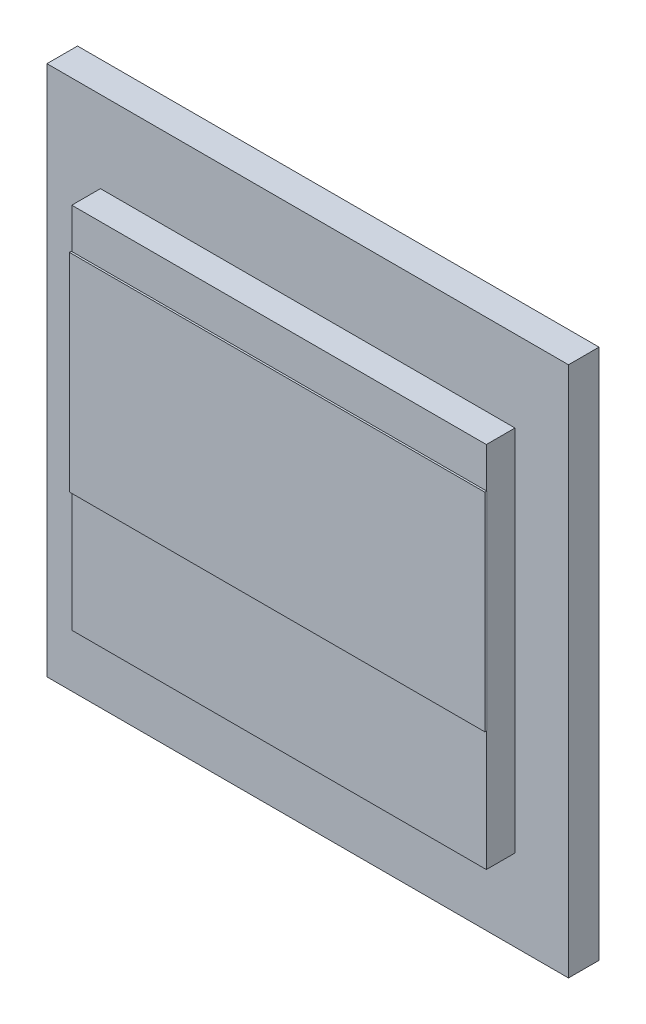
ISO-10303-21;
HEADER;
FILE_DESCRIPTION(('STEP AP214'),'2;1');
FILE_NAME('part.step','',(''),(''),'','','');
FILE_SCHEMA(('AUTOMOTIVE_DESIGN { 1 0 10303 214 1 1 1 1 }'));
ENDSEC;
DATA;
#1=APPLICATION_CONTEXT('core data for automotive mechanical design processes');
#2=APPLICATION_PROTOCOL_DEFINITION('international standard','automotive_design',2000,#1);
#3=PRODUCT_CONTEXT('',#1,'mechanical');
#4=PRODUCT('Part','Part','',(#3));
#5=PRODUCT_RELATED_PRODUCT_CATEGORY('part','',(#4));
#6=PRODUCT_DEFINITION_FORMATION('','',#4);
#7=PRODUCT_DEFINITION_CONTEXT('part definition',#1,'design');
#8=PRODUCT_DEFINITION('design','',#6,#7);
#9=PRODUCT_DEFINITION_SHAPE('','',#8);
#10=(LENGTH_UNIT() NAMED_UNIT(*) SI_UNIT(.MILLI.,.METRE.));
#11=(NAMED_UNIT(*) PLANE_ANGLE_UNIT() SI_UNIT($,.RADIAN.));
#12=(NAMED_UNIT(*) SI_UNIT($,.STERADIAN.) SOLID_ANGLE_UNIT());
#13=UNCERTAINTY_MEASURE_WITH_UNIT(LENGTH_MEASURE(1.E-05),#10,'distance_accuracy_value','');
#14=(GEOMETRIC_REPRESENTATION_CONTEXT(3) GLOBAL_UNCERTAINTY_ASSIGNED_CONTEXT((#13)) GLOBAL_UNIT_ASSIGNED_CONTEXT((#10,
#11,#12)) REPRESENTATION_CONTEXT('',''));
#15=CARTESIAN_POINT('',(0.,0.,0.));
#16=DIRECTION('',(0.,0.,1.));
#17=DIRECTION('',(1.,0.,0.));
#18=AXIS2_PLACEMENT_3D('',#15,#16,#17);
#19=CARTESIAN_POINT('',(0.,0.,3.1));
#20=DIRECTION('',(0.,0.,1.));
#21=DIRECTION('',(1.,0.,0.));
#22=AXIS2_PLACEMENT_3D('',#19,#20,#21);
#23=PLANE('',#22);
#24=DIRECTION('',(-1.,0.,0.));
#25=VECTOR('',#24,1.);
#26=CARTESIAN_POINT('',(-10.872,7.534,3.1));
#27=LINE('',#26,#25);
#28=CARTESIAN_POINT('',(10.85,7.534,3.1));
#29=VERTEX_POINT('',#28);
#30=CARTESIAN_POINT('',(-10.85,7.534,3.1));
#31=VERTEX_POINT('',#30);
#32=EDGE_CURVE('E11',#29,#31,#27,.T.);
#33=ORIENTED_EDGE('',*,*,#32,.F.);
#34=DIRECTION('',(0.,1.,0.));
#35=VECTOR('',#34,1.);
#36=CARTESIAN_POINT('',(10.85,9.634,3.1));
#37=LINE('',#36,#35);
#38=CARTESIAN_POINT('',(10.85,9.634,3.1));
#39=VERTEX_POINT('',#38);
#40=EDGE_CURVE('E177',#29,#39,#37,.T.);
#41=ORIENTED_EDGE('',*,*,#40,.T.);
#42=DIRECTION('',(-1.,0.,0.));
#43=VECTOR('',#42,1.);
#44=CARTESIAN_POINT('',(-10.85,9.634,3.1));
#45=LINE('',#44,#43);
#46=CARTESIAN_POINT('',(-10.85,9.634,3.1));
#47=VERTEX_POINT('',#46);
#48=EDGE_CURVE('E180',#39,#47,#45,.T.);
#49=ORIENTED_EDGE('',*,*,#48,.T.);
#50=DIRECTION('',(0.,-1.,0.));
#51=VECTOR('',#50,1.);
#52=CARTESIAN_POINT('',(-10.85,9.634,3.1));
#53=LINE('',#52,#51);
#54=EDGE_CURVE('E171',#47,#31,#53,.T.);
#55=ORIENTED_EDGE('',*,*,#54,.T.);
#56=EDGE_LOOP('',(#33,#41,#49,#55));
#57=FACE_BOUND('',#56,.T.);
#58=ADVANCED_FACE('F34',(#57),#23,.T.);
#59=CARTESIAN_POINT('',(0.,0.,1.6));
#60=DIRECTION('',(0.,0.,1.));
#61=DIRECTION('',(1.,0.,0.));
#62=AXIS2_PLACEMENT_3D('',#59,#60,#61);
#63=PLANE('',#62);
#64=DIRECTION('',(0.,-1.,0.));
#65=VECTOR('',#64,1.);
#66=CARTESIAN_POINT('',(-13.65,13.9,1.6));
#67=LINE('',#66,#65);
#68=CARTESIAN_POINT('',(-13.65,13.9,1.6));
#69=VERTEX_POINT('',#68);
#70=CARTESIAN_POINT('',(-13.65,-13.9,1.6));
#71=VERTEX_POINT('',#70);
#72=EDGE_CURVE('E200',#69,#71,#67,.T.);
#73=ORIENTED_EDGE('',*,*,#72,.T.);
#74=DIRECTION('',(1.,0.,0.));
#75=VECTOR('',#74,1.);
#76=CARTESIAN_POINT('',(-13.65,-13.9,1.6));
#77=LINE('',#76,#75);
#78=CARTESIAN_POINT('',(13.65,-13.9,1.6));
#79=VERTEX_POINT('',#78);
#80=EDGE_CURVE('E203',#71,#79,#77,.T.);
#81=ORIENTED_EDGE('',*,*,#80,.T.);
#82=DIRECTION('',(0.,1.,0.));
#83=VECTOR('',#82,1.);
#84=CARTESIAN_POINT('',(13.65,13.9,1.6));
#85=LINE('',#84,#83);
#86=CARTESIAN_POINT('',(13.65,13.9,1.6));
#87=VERTEX_POINT('',#86);
#88=EDGE_CURVE('E206',#79,#87,#85,.T.);
#89=ORIENTED_EDGE('',*,*,#88,.T.);
#90=DIRECTION('',(-1.,0.,0.));
#91=VECTOR('',#90,1.);
#92=CARTESIAN_POINT('',(-13.65,13.9,1.6));
#93=LINE('',#92,#91);
#94=EDGE_CURVE('E208',#87,#69,#93,.T.);
#95=ORIENTED_EDGE('',*,*,#94,.T.);
#96=EDGE_LOOP('',(#73,#81,#89,#95));
#97=FACE_BOUND('',#96,.T.);
#98=DIRECTION('',(1.,0.,0.));
#99=VECTOR('',#98,1.);
#100=CARTESIAN_POINT('',(-10.85,-9.634,1.6));
#101=LINE('',#100,#99);
#102=CARTESIAN_POINT('',(-10.85,-9.634,1.6));
#103=VERTEX_POINT('',#102);
#104=CARTESIAN_POINT('',(10.85,-9.634,1.6));
#105=VERTEX_POINT('',#104);
#106=EDGE_CURVE('E165',#103,#105,#101,.T.);
#107=ORIENTED_EDGE('',*,*,#106,.F.);
#108=DIRECTION('',(0.,-1.,0.));
#109=VECTOR('',#108,1.);
#110=CARTESIAN_POINT('',(-10.85,9.634,1.6));
#111=LINE('',#110,#109);
#112=CARTESIAN_POINT('',(-10.85,9.634,1.6));
#113=VERTEX_POINT('',#112);
#114=EDGE_CURVE('E162',#113,#103,#111,.T.);
#115=ORIENTED_EDGE('',*,*,#114,.F.);
#116=DIRECTION('',(-1.,0.,0.));
#117=VECTOR('',#116,1.);
#118=CARTESIAN_POINT('',(-10.85,9.634,1.6));
#119=LINE('',#118,#117);
#120=CARTESIAN_POINT('',(10.85,9.634,1.6));
#121=VERTEX_POINT('',#120);
#122=EDGE_CURVE('E188',#121,#113,#119,.T.);
#123=ORIENTED_EDGE('',*,*,#122,.F.);
#124=DIRECTION('',(0.,1.,0.));
#125=VECTOR('',#124,1.);
#126=CARTESIAN_POINT('',(10.85,9.634,1.6));
#127=LINE('',#126,#125);
#128=EDGE_CURVE('E185',#105,#121,#127,.T.);
#129=ORIENTED_EDGE('',*,*,#128,.F.);
#130=EDGE_LOOP('',(#107,#115,#123,#129));
#131=FACE_BOUND('',#130,.T.);
#132=ADVANCED_FACE('F281',(#97,#131),#63,.T.);
#133=CARTESIAN_POINT('',(-13.65,13.9,1.6));
#134=DIRECTION('',(1.,0.,0.));
#135=DIRECTION('',(0.,1.,0.));
#136=AXIS2_PLACEMENT_3D('',#133,#134,#135);
#137=PLANE('',#136);
#138=DIRECTION('',(0.,-1.,0.));
#139=VECTOR('',#138,1.);
#140=CARTESIAN_POINT('',(-13.65,13.9,0.));
#141=LINE('',#140,#139);
#142=CARTESIAN_POINT('',(-13.65,13.9,0.));
#143=VERTEX_POINT('',#142);
#144=CARTESIAN_POINT('',(-13.65,-13.9,0.));
#145=VERTEX_POINT('',#144);
#146=EDGE_CURVE('E199',#143,#145,#141,.T.);
#147=ORIENTED_EDGE('',*,*,#146,.T.);
#148=DIRECTION('',(0.,0.,-1.));
#149=VECTOR('',#148,1.);
#150=CARTESIAN_POINT('',(-13.65,-13.9,1.6));
#151=LINE('',#150,#149);
#152=EDGE_CURVE('E38',#71,#145,#151,.T.);
#153=ORIENTED_EDGE('',*,*,#152,.F.);
#154=ORIENTED_EDGE('',*,*,#72,.F.);
#155=DIRECTION('',(0.,0.,-1.));
#156=VECTOR('',#155,1.);
#157=CARTESIAN_POINT('',(-13.65,13.9,1.6));
#158=LINE('',#157,#156);
#159=EDGE_CURVE('E210',#69,#143,#158,.T.);
#160=ORIENTED_EDGE('',*,*,#159,.T.);
#161=EDGE_LOOP('',(#147,#153,#154,#160));
#162=FACE_BOUND('',#161,.T.);
#163=ADVANCED_FACE('F36',(#162),#137,.F.);
#164=CARTESIAN_POINT('',(-13.65,-13.9,1.6));
#165=DIRECTION('',(0.,1.,0.));
#166=DIRECTION('',(0.,0.,1.));
#167=AXIS2_PLACEMENT_3D('',#164,#165,#166);
#168=PLANE('',#167);
#169=DIRECTION('',(1.,0.,0.));
#170=VECTOR('',#169,1.);
#171=CARTESIAN_POINT('',(-13.65,-13.9,0.));
#172=LINE('',#171,#170);
#173=CARTESIAN_POINT('',(13.65,-13.9,0.));
#174=VERTEX_POINT('',#173);
#175=EDGE_CURVE('E213',#145,#174,#172,.T.);
#176=ORIENTED_EDGE('',*,*,#175,.T.);
#177=DIRECTION('',(0.,0.,-1.));
#178=VECTOR('',#177,1.);
#179=CARTESIAN_POINT('',(13.65,-13.9,1.6));
#180=LINE('',#179,#178);
#181=EDGE_CURVE('E222',#79,#174,#180,.T.);
#182=ORIENTED_EDGE('',*,*,#181,.F.);
#183=ORIENTED_EDGE('',*,*,#80,.F.);
#184=ORIENTED_EDGE('',*,*,#152,.T.);
#185=EDGE_LOOP('',(#176,#182,#183,#184));
#186=FACE_BOUND('',#185,.T.);
#187=ADVANCED_FACE('F289',(#186),#168,.F.);
#188=CARTESIAN_POINT('',(13.65,13.9,1.6));
#189=DIRECTION('',(-1.,0.,0.));
#190=DIRECTION('',(0.,-1.,0.));
#191=AXIS2_PLACEMENT_3D('',#188,#189,#190);
#192=PLANE('',#191);
#193=DIRECTION('',(0.,1.,0.));
#194=VECTOR('',#193,1.);
#195=CARTESIAN_POINT('',(13.65,13.9,0.));
#196=LINE('',#195,#194);
#197=CARTESIAN_POINT('',(13.65,13.9,0.));
#198=VERTEX_POINT('',#197);
#199=EDGE_CURVE('E215',#174,#198,#196,.T.);
#200=ORIENTED_EDGE('',*,*,#199,.T.);
#201=DIRECTION('',(0.,0.,-1.));
#202=VECTOR('',#201,1.);
#203=CARTESIAN_POINT('',(13.65,13.9,1.6));
#204=LINE('',#203,#202);
#205=EDGE_CURVE('E220',#87,#198,#204,.T.);
#206=ORIENTED_EDGE('',*,*,#205,.F.);
#207=ORIENTED_EDGE('',*,*,#88,.F.);
#208=ORIENTED_EDGE('',*,*,#181,.T.);
#209=EDGE_LOOP('',(#200,#206,#207,#208));
#210=FACE_BOUND('',#209,.T.);
#211=ADVANCED_FACE('F302',(#210),#192,.F.);
#212=CARTESIAN_POINT('',(-13.65,13.9,1.6));
#213=DIRECTION('',(0.,-1.,0.));
#214=DIRECTION('',(0.,0.,-1.));
#215=AXIS2_PLACEMENT_3D('',#212,#213,#214);
#216=PLANE('',#215);
#217=DIRECTION('',(-1.,0.,0.));
#218=VECTOR('',#217,1.);
#219=CARTESIAN_POINT('',(-13.65,13.9,0.));
#220=LINE('',#219,#218);
#221=EDGE_CURVE('E204',#198,#143,#220,.T.);
#222=ORIENTED_EDGE('',*,*,#221,.T.);
#223=ORIENTED_EDGE('',*,*,#159,.F.);
#224=ORIENTED_EDGE('',*,*,#94,.F.);
#225=ORIENTED_EDGE('',*,*,#205,.T.);
#226=EDGE_LOOP('',(#222,#223,#224,#225));
#227=FACE_BOUND('',#226,.T.);
#228=ADVANCED_FACE('F298',(#227),#216,.F.);
#229=CARTESIAN_POINT('',(0.,0.,0.));
#230=DIRECTION('',(0.,0.,1.));
#231=DIRECTION('',(1.,0.,0.));
#232=AXIS2_PLACEMENT_3D('',#229,#230,#231);
#233=PLANE('',#232);
#234=ORIENTED_EDGE('',*,*,#146,.F.);
#235=ORIENTED_EDGE('',*,*,#221,.F.);
#236=ORIENTED_EDGE('',*,*,#199,.F.);
#237=ORIENTED_EDGE('',*,*,#175,.F.);
#238=EDGE_LOOP('',(#234,#235,#236,#237));
#239=FACE_BOUND('',#238,.T.);
#240=ADVANCED_FACE('F295',(#239),#233,.F.);
#241=CARTESIAN_POINT('',(-10.85,9.634,3.1));
#242=DIRECTION('',(1.,0.,0.));
#243=DIRECTION('',(0.,1.,0.));
#244=AXIS2_PLACEMENT_3D('',#241,#242,#243);
#245=PLANE('',#244);
#246=ORIENTED_EDGE('',*,*,#114,.T.);
#247=DIRECTION('',(0.,0.,-1.));
#248=VECTOR('',#247,1.);
#249=CARTESIAN_POINT('',(-10.85,-9.634,3.1));
#250=LINE('',#249,#248);
#251=CARTESIAN_POINT('',(-10.85,-9.634,3.1));
#252=VERTEX_POINT('',#251);
#253=EDGE_CURVE('E197',#252,#103,#250,.T.);
#254=ORIENTED_EDGE('',*,*,#253,.F.);
#255=CARTESIAN_POINT('',(-10.85,-3.33,3.1));
#256=VERTEX_POINT('',#255);
#257=EDGE_CURVE('E175',#256,#252,#53,.T.);
#258=ORIENTED_EDGE('',*,*,#257,.F.);
#259=EDGE_CURVE('E174',#31,#256,#53,.T.);
#260=ORIENTED_EDGE('',*,*,#259,.F.);
#261=ORIENTED_EDGE('',*,*,#54,.F.);
#262=DIRECTION('',(0.,0.,-1.));
#263=VECTOR('',#262,1.);
#264=CARTESIAN_POINT('',(-10.85,9.634,3.1));
#265=LINE('',#264,#263);
#266=EDGE_CURVE('E182',#47,#113,#265,.T.);
#267=ORIENTED_EDGE('',*,*,#266,.T.);
#268=EDGE_LOOP('',(#246,#254,#258,#260,#261,#267));
#269=FACE_BOUND('',#268,.T.);
#270=ADVANCED_FACE('F269',(#269),#245,.F.);
#271=CARTESIAN_POINT('',(-10.85,-9.634,3.1));
#272=DIRECTION('',(0.,1.,0.));
#273=DIRECTION('',(-1.,0.,0.));
#274=AXIS2_PLACEMENT_3D('',#271,#272,#273);
#275=PLANE('',#274);
#276=ORIENTED_EDGE('',*,*,#106,.T.);
#277=DIRECTION('',(0.,0.,-1.));
#278=VECTOR('',#277,1.);
#279=CARTESIAN_POINT('',(10.85,-9.634,3.1));
#280=LINE('',#279,#278);
#281=CARTESIAN_POINT('',(10.85,-9.634,3.1));
#282=VERTEX_POINT('',#281);
#283=EDGE_CURVE('E194',#282,#105,#280,.T.);
#284=ORIENTED_EDGE('',*,*,#283,.F.);
#285=DIRECTION('',(1.,0.,0.));
#286=VECTOR('',#285,1.);
#287=CARTESIAN_POINT('',(-10.85,-9.634,3.1));
#288=LINE('',#287,#286);
#289=EDGE_CURVE('E173',#252,#282,#288,.T.);
#290=ORIENTED_EDGE('',*,*,#289,.F.);
#291=ORIENTED_EDGE('',*,*,#253,.T.);
#292=EDGE_LOOP('',(#276,#284,#290,#291));
#293=FACE_BOUND('',#292,.T.);
#294=ADVANCED_FACE('F278',(#293),#275,.F.);
#295=CARTESIAN_POINT('',(10.85,9.634,3.1));
#296=DIRECTION('',(-1.,0.,0.));
#297=DIRECTION('',(0.,-1.,0.));
#298=AXIS2_PLACEMENT_3D('',#295,#296,#297);
#299=PLANE('',#298);
#300=ORIENTED_EDGE('',*,*,#128,.T.);
#301=DIRECTION('',(0.,0.,-1.));
#302=VECTOR('',#301,1.);
#303=CARTESIAN_POINT('',(10.85,9.634,3.1));
#304=LINE('',#303,#302);
#305=EDGE_CURVE('E192',#39,#121,#304,.T.);
#306=ORIENTED_EDGE('',*,*,#305,.F.);
#307=ORIENTED_EDGE('',*,*,#40,.F.);
#308=CARTESIAN_POINT('',(10.85,-3.33,3.1));
#309=VERTEX_POINT('',#308);
#310=EDGE_CURVE('E181',#309,#29,#37,.T.);
#311=ORIENTED_EDGE('',*,*,#310,.F.);
#312=EDGE_CURVE('E178',#282,#309,#37,.T.);
#313=ORIENTED_EDGE('',*,*,#312,.F.);
#314=ORIENTED_EDGE('',*,*,#283,.T.);
#315=EDGE_LOOP('',(#300,#306,#307,#311,#313,#314));
#316=FACE_BOUND('',#315,.T.);
#317=ADVANCED_FACE('F261',(#316),#299,.F.);
#318=CARTESIAN_POINT('',(-10.85,9.634,3.1));
#319=DIRECTION('',(0.,-1.,0.));
#320=DIRECTION('',(1.,0.,0.));
#321=AXIS2_PLACEMENT_3D('',#318,#319,#320);
#322=PLANE('',#321);
#323=ORIENTED_EDGE('',*,*,#122,.T.);
#324=ORIENTED_EDGE('',*,*,#266,.F.);
#325=ORIENTED_EDGE('',*,*,#48,.F.);
#326=ORIENTED_EDGE('',*,*,#305,.T.);
#327=EDGE_LOOP('',(#323,#324,#325,#326));
#328=FACE_BOUND('',#327,.T.);
#329=ADVANCED_FACE('F265',(#328),#322,.F.);
#330=DIRECTION('',(1.,0.,0.));
#331=VECTOR('',#330,1.);
#332=CARTESIAN_POINT('',(-10.872,-3.33,3.1));
#333=LINE('',#332,#331);
#334=EDGE_CURVE('E43',#256,#309,#333,.T.);
#335=ORIENTED_EDGE('',*,*,#334,.F.);
#336=ORIENTED_EDGE('',*,*,#257,.T.);
#337=ORIENTED_EDGE('',*,*,#289,.T.);
#338=ORIENTED_EDGE('',*,*,#312,.T.);
#339=EDGE_LOOP('',(#335,#336,#337,#338));
#340=FACE_BOUND('',#339,.T.);
#341=ADVANCED_FACE('F274',(#340),#23,.T.);
#342=CARTESIAN_POINT('',(0.,0.,3.1));
#343=DIRECTION('',(0.,0.,1.));
#344=DIRECTION('',(1.,0.,0.));
#345=AXIS2_PLACEMENT_3D('',#342,#343,#344);
#346=PLANE('',#345);
#347=CARTESIAN_POINT('',(-10.872,7.534,3.1));
#348=VERTEX_POINT('',#347);
#349=EDGE_CURVE('E46',#31,#348,#27,.T.);
#350=ORIENTED_EDGE('',*,*,#349,.F.);
#351=ORIENTED_EDGE('',*,*,#259,.T.);
#352=CARTESIAN_POINT('',(-10.872,-3.33,3.1));
#353=VERTEX_POINT('',#352);
#354=EDGE_CURVE('E232',#353,#256,#333,.T.);
#355=ORIENTED_EDGE('',*,*,#354,.F.);
#356=DIRECTION('',(0.,-1.,0.));
#357=VECTOR('',#356,1.);
#358=CARTESIAN_POINT('',(-10.872,7.534,3.1));
#359=LINE('',#358,#357);
#360=EDGE_CURVE('E161',#348,#353,#359,.T.);
#361=ORIENTED_EDGE('',*,*,#360,.F.);
#362=EDGE_LOOP('',(#350,#351,#355,#361));
#363=FACE_BOUND('',#362,.T.);
#364=ADVANCED_FACE('F272',(#363),#346,.F.);
#365=CARTESIAN_POINT('',(10.872,-3.33,3.1));
#366=VERTEX_POINT('',#365);
#367=EDGE_CURVE('E233',#309,#366,#333,.T.);
#368=ORIENTED_EDGE('',*,*,#367,.F.);
#369=ORIENTED_EDGE('',*,*,#310,.T.);
#370=CARTESIAN_POINT('',(10.872,7.53400000000001,3.1));
#371=VERTEX_POINT('',#370);
#372=EDGE_CURVE('E45',#371,#29,#27,.T.);
#373=ORIENTED_EDGE('',*,*,#372,.F.);
#374=DIRECTION('',(0.,1.,0.));
#375=VECTOR('',#374,1.);
#376=CARTESIAN_POINT('',(10.872,7.53400000000001,3.1));
#377=LINE('',#376,#375);
#378=EDGE_CURVE('E236',#366,#371,#377,.T.);
#379=ORIENTED_EDGE('',*,*,#378,.F.);
#380=EDGE_LOOP('',(#368,#369,#373,#379));
#381=FACE_BOUND('',#380,.T.);
#382=ADVANCED_FACE('F254',(#381),#346,.F.);
#383=CARTESIAN_POINT('',(-10.872,7.534,3.2));
#384=DIRECTION('',(1.,0.,0.));
#385=DIRECTION('',(0.,1.,0.));
#386=AXIS2_PLACEMENT_3D('',#383,#384,#385);
#387=PLANE('',#386);
#388=ORIENTED_EDGE('',*,*,#360,.T.);
#389=DIRECTION('',(0.,0.,-1.));
#390=VECTOR('',#389,1.);
#391=CARTESIAN_POINT('',(-10.872,-3.33,3.2));
#392=LINE('',#391,#390);
#393=CARTESIAN_POINT('',(-10.872,-3.33,3.2));
#394=VERTEX_POINT('',#393);
#395=EDGE_CURVE('E142',#394,#353,#392,.T.);
#396=ORIENTED_EDGE('',*,*,#395,.F.);
#397=DIRECTION('',(0.,-1.,0.));
#398=VECTOR('',#397,1.);
#399=CARTESIAN_POINT('',(-10.872,7.534,3.2));
#400=LINE('',#399,#398);
#401=CARTESIAN_POINT('',(-10.872,7.534,3.2));
#402=VERTEX_POINT('',#401);
#403=EDGE_CURVE('E149',#402,#394,#400,.T.);
#404=ORIENTED_EDGE('',*,*,#403,.F.);
#405=DIRECTION('',(0.,0.,-1.));
#406=VECTOR('',#405,1.);
#407=CARTESIAN_POINT('',(-10.872,7.534,3.2));
#408=LINE('',#407,#406);
#409=EDGE_CURVE('E240',#402,#348,#408,.T.);
#410=ORIENTED_EDGE('',*,*,#409,.T.);
#411=EDGE_LOOP('',(#388,#396,#404,#410));
#412=FACE_BOUND('',#411,.T.);
#413=ADVANCED_FACE('F159',(#412),#387,.F.);
#414=CARTESIAN_POINT('',(-10.872,-3.33,3.2));
#415=DIRECTION('',(0.,1.,0.));
#416=DIRECTION('',(-1.,0.,0.));
#417=AXIS2_PLACEMENT_3D('',#414,#415,#416);
#418=PLANE('',#417);
#419=ORIENTED_EDGE('',*,*,#354,.T.);
#420=ORIENTED_EDGE('',*,*,#334,.T.);
#421=ORIENTED_EDGE('',*,*,#367,.T.);
#422=DIRECTION('',(0.,0.,-1.));
#423=VECTOR('',#422,1.);
#424=CARTESIAN_POINT('',(10.872,-3.33,3.2));
#425=LINE('',#424,#423);
#426=CARTESIAN_POINT('',(10.872,-3.33,3.2));
#427=VERTEX_POINT('',#426);
#428=EDGE_CURVE('E145',#427,#366,#425,.T.);
#429=ORIENTED_EDGE('',*,*,#428,.F.);
#430=DIRECTION('',(1.,0.,0.));
#431=VECTOR('',#430,1.);
#432=CARTESIAN_POINT('',(-10.872,-3.33,3.2));
#433=LINE('',#432,#431);
#434=EDGE_CURVE('E137',#394,#427,#433,.T.);
#435=ORIENTED_EDGE('',*,*,#434,.F.);
#436=ORIENTED_EDGE('',*,*,#395,.T.);
#437=EDGE_LOOP('',(#419,#420,#421,#429,#435,#436));
#438=FACE_BOUND('',#437,.T.);
#439=ADVANCED_FACE('F140',(#438),#418,.F.);
#440=CARTESIAN_POINT('',(10.872,7.53400000000001,3.2));
#441=DIRECTION('',(-1.,0.,0.));
#442=DIRECTION('',(0.,-1.,0.));
#443=AXIS2_PLACEMENT_3D('',#440,#441,#442);
#444=PLANE('',#443);
#445=ORIENTED_EDGE('',*,*,#378,.T.);
#446=DIRECTION('',(0.,0.,-1.));
#447=VECTOR('',#446,1.);
#448=CARTESIAN_POINT('',(10.872,7.53400000000001,3.2));
#449=LINE('',#448,#447);
#450=CARTESIAN_POINT('',(10.872,7.53400000000001,3.2));
#451=VERTEX_POINT('',#450);
#452=EDGE_CURVE('E167',#451,#371,#449,.T.);
#453=ORIENTED_EDGE('',*,*,#452,.F.);
#454=DIRECTION('',(0.,1.,0.));
#455=VECTOR('',#454,1.);
#456=CARTESIAN_POINT('',(10.872,7.53400000000001,3.2));
#457=LINE('',#456,#455);
#458=EDGE_CURVE('E148',#427,#451,#457,.T.);
#459=ORIENTED_EDGE('',*,*,#458,.F.);
#460=ORIENTED_EDGE('',*,*,#428,.T.);
#461=EDGE_LOOP('',(#445,#453,#459,#460));
#462=FACE_BOUND('',#461,.T.);
#463=ADVANCED_FACE('F244',(#462),#444,.F.);
#464=CARTESIAN_POINT('',(-10.872,7.534,3.2));
#465=DIRECTION('',(0.,-1.,0.));
#466=DIRECTION('',(1.,0.,0.));
#467=AXIS2_PLACEMENT_3D('',#464,#465,#466);
#468=PLANE('',#467);
#469=ORIENTED_EDGE('',*,*,#372,.T.);
#470=ORIENTED_EDGE('',*,*,#32,.T.);
#471=ORIENTED_EDGE('',*,*,#349,.T.);
#472=ORIENTED_EDGE('',*,*,#409,.F.);
#473=DIRECTION('',(-1.,0.,0.));
#474=VECTOR('',#473,1.);
#475=CARTESIAN_POINT('',(-10.872,7.534,3.2));
#476=LINE('',#475,#474);
#477=EDGE_CURVE('E154',#451,#402,#476,.T.);
#478=ORIENTED_EDGE('',*,*,#477,.F.);
#479=ORIENTED_EDGE('',*,*,#452,.T.);
#480=EDGE_LOOP('',(#469,#470,#471,#472,#478,#479));
#481=FACE_BOUND('',#480,.T.);
#482=ADVANCED_FACE('F249',(#481),#468,.F.);
#483=CARTESIAN_POINT('',(0.,0.,3.2));
#484=DIRECTION('',(0.,0.,1.));
#485=DIRECTION('',(1.,0.,0.));
#486=AXIS2_PLACEMENT_3D('',#483,#484,#485);
#487=PLANE('',#486);
#488=ORIENTED_EDGE('',*,*,#403,.T.);
#489=ORIENTED_EDGE('',*,*,#434,.T.);
#490=ORIENTED_EDGE('',*,*,#458,.T.);
#491=ORIENTED_EDGE('',*,*,#477,.T.);
#492=EDGE_LOOP('',(#488,#489,#490,#491));
#493=FACE_BOUND('',#492,.T.);
#494=ADVANCED_FACE('F152',(#493),#487,.T.);
#495=CLOSED_SHELL('',(#58,#132,#163,#187,#211,#228,#240,#270,#294,#317,#329,#341,#364,#382,#413,
#439,#463,#482,#494));
#496=MANIFOLD_SOLID_BREP('B2',#495);
#497=ADVANCED_BREP_SHAPE_REPRESENTATION('',(#18,#496),#14);
#498=SHAPE_DEFINITION_REPRESENTATION(#9,#497);
ENDSEC;
END-ISO-10303-21;
